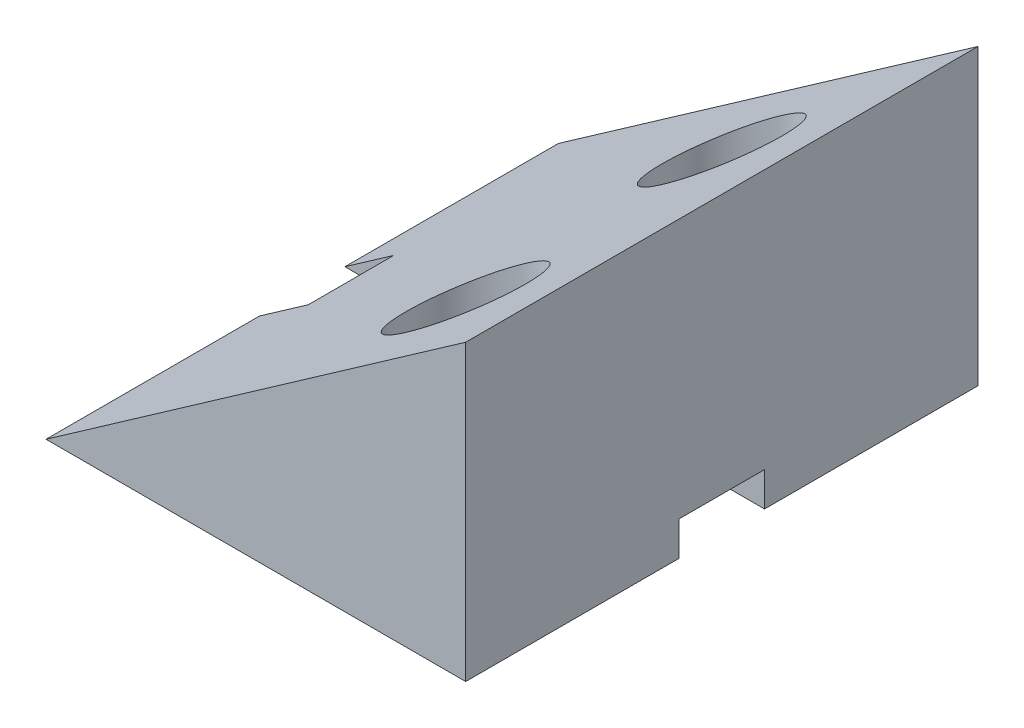
ISO-10303-21;
HEADER;
FILE_DESCRIPTION(('STEP AP214'),'2;1');
FILE_NAME('part.step','',(''),(''),'','','');
FILE_SCHEMA(('AUTOMOTIVE_DESIGN { 1 0 10303 214 1 1 1 1 }'));
ENDSEC;
DATA;
#1=APPLICATION_CONTEXT('core data for automotive mechanical design processes');
#2=APPLICATION_PROTOCOL_DEFINITION('international standard','automotive_design',2000,#1);
#3=PRODUCT_CONTEXT('',#1,'mechanical');
#4=PRODUCT('Part','Part','',(#3));
#5=PRODUCT_RELATED_PRODUCT_CATEGORY('part','',(#4));
#6=PRODUCT_DEFINITION_FORMATION('','',#4);
#7=PRODUCT_DEFINITION_CONTEXT('part definition',#1,'design');
#8=PRODUCT_DEFINITION('design','',#6,#7);
#9=PRODUCT_DEFINITION_SHAPE('','',#8);
#10=(LENGTH_UNIT() NAMED_UNIT(*) SI_UNIT(.MILLI.,.METRE.));
#11=(NAMED_UNIT(*) PLANE_ANGLE_UNIT() SI_UNIT($,.RADIAN.));
#12=(NAMED_UNIT(*) SI_UNIT($,.STERADIAN.) SOLID_ANGLE_UNIT());
#13=UNCERTAINTY_MEASURE_WITH_UNIT(LENGTH_MEASURE(1.E-05),#10,'distance_accuracy_value','');
#14=(GEOMETRIC_REPRESENTATION_CONTEXT(3) GLOBAL_UNCERTAINTY_ASSIGNED_CONTEXT((#13)) GLOBAL_UNIT_ASSIGNED_CONTEXT((#10,
#11,#12)) REPRESENTATION_CONTEXT('',''));
#15=CARTESIAN_POINT('',(0.,0.,0.));
#16=DIRECTION('',(0.,0.,1.));
#17=DIRECTION('',(1.,0.,0.));
#18=AXIS2_PLACEMENT_3D('',#15,#16,#17);
#19=CARTESIAN_POINT('',(0.,0.,30.));
#20=DIRECTION('',(0.,1.,0.));
#21=DIRECTION('',(-1.,0.,0.));
#22=AXIS2_PLACEMENT_3D('',#19,#20,#21);
#23=PLANE('',#22);
#24=CARTESIAN_POINT('',(-7.5,0.,22.5));
#25=DIRECTION('',(0.,1.,0.));
#26=DIRECTION('',(-1.,0.,0.));
#27=AXIS2_PLACEMENT_3D('',#24,#25,#26);
#28=CIRCLE('',#27,1.75);
#29=CARTESIAN_POINT('',(-9.25,0.,22.5));
#30=VERTEX_POINT('',#29);
#31=EDGE_CURVE('E143',#30,#30,#28,.F.);
#32=ORIENTED_EDGE('',*,*,#31,.F.);
#33=EDGE_LOOP('',(#32));
#34=FACE_BOUND('',#33,.T.);
#35=DIRECTION('',(0.,0.,-1.));
#36=VECTOR('',#35,1.);
#37=CARTESIAN_POINT('',(-24.5745613286699,0.,30.));
#38=LINE('',#37,#36);
#39=CARTESIAN_POINT('',(-24.5745613286699,0.,30.));
#40=VERTEX_POINT('',#39);
#41=CARTESIAN_POINT('',(-24.5745613286699,0.,17.5));
#42=VERTEX_POINT('',#41);
#43=EDGE_CURVE('E42',#40,#42,#38,.T.);
#44=ORIENTED_EDGE('',*,*,#43,.T.);
#45=DIRECTION('',(1.,0.,0.));
#46=VECTOR('',#45,1.);
#47=CARTESIAN_POINT('',(-24.5755613286699,0.,17.5));
#48=LINE('',#47,#46);
#49=CARTESIAN_POINT('',(0.,0.,17.5));
#50=VERTEX_POINT('',#49);
#51=EDGE_CURVE('E103',#42,#50,#48,.T.);
#52=ORIENTED_EDGE('',*,*,#51,.T.);
#53=DIRECTION('',(0.,0.,-1.));
#54=VECTOR('',#53,1.);
#55=CARTESIAN_POINT('',(0.,0.,30.));
#56=LINE('',#55,#54);
#57=CARTESIAN_POINT('',(0.,0.,30.));
#58=VERTEX_POINT('',#57);
#59=EDGE_CURVE('E121',#58,#50,#56,.T.);
#60=ORIENTED_EDGE('',*,*,#59,.F.);
#61=DIRECTION('',(1.,0.,0.));
#62=VECTOR('',#61,1.);
#63=CARTESIAN_POINT('',(0.,0.,30.));
#64=LINE('',#63,#62);
#65=EDGE_CURVE('E58',#40,#58,#64,.T.);
#66=ORIENTED_EDGE('',*,*,#65,.F.);
#67=EDGE_LOOP('',(#44,#52,#60,#66));
#68=FACE_BOUND('',#67,.T.);
#69=ADVANCED_FACE('F34',(#34,#68),#23,.F.);
#70=CARTESIAN_POINT('',(0.,17.2072930905312,30.));
#71=DIRECTION('',(-1.,0.,0.));
#72=DIRECTION('',(0.,-1.,0.));
#73=AXIS2_PLACEMENT_3D('',#70,#71,#72);
#74=PLANE('',#73);
#75=ORIENTED_EDGE('',*,*,#59,.T.);
#76=DIRECTION('',(0.,-1.,0.));
#77=VECTOR('',#76,1.);
#78=CARTESIAN_POINT('',(0.,2.,17.5));
#79=LINE('',#78,#77);
#80=CARTESIAN_POINT('',(0.,2.,17.5));
#81=VERTEX_POINT('',#80);
#82=EDGE_CURVE('E109',#81,#50,#79,.T.);
#83=ORIENTED_EDGE('',*,*,#82,.F.);
#84=DIRECTION('',(0.,0.,1.));
#85=VECTOR('',#84,1.);
#86=CARTESIAN_POINT('',(0.,2.,17.5));
#87=LINE('',#86,#85);
#88=CARTESIAN_POINT('',(0.,2.,12.5));
#89=VERTEX_POINT('',#88);
#90=EDGE_CURVE('E114',#89,#81,#87,.T.);
#91=ORIENTED_EDGE('',*,*,#90,.F.);
#92=DIRECTION('',(0.,1.,0.));
#93=VECTOR('',#92,1.);
#94=CARTESIAN_POINT('',(0.,2.,12.5));
#95=LINE('',#94,#93);
#96=CARTESIAN_POINT('',(0.,0.,12.5));
#97=VERTEX_POINT('',#96);
#98=EDGE_CURVE('E166',#97,#89,#95,.T.);
#99=ORIENTED_EDGE('',*,*,#98,.F.);
#100=CARTESIAN_POINT('',(0.,0.,0.));
#101=VERTEX_POINT('',#100);
#102=EDGE_CURVE('E76',#97,#101,#56,.T.);
#103=ORIENTED_EDGE('',*,*,#102,.T.);
#104=DIRECTION('',(0.,1.,0.));
#105=VECTOR('',#104,1.);
#106=CARTESIAN_POINT('',(0.,17.2072930905312,0.));
#107=LINE('',#106,#105);
#108=CARTESIAN_POINT('',(0.,17.2072930905312,0.));
#109=VERTEX_POINT('',#108);
#110=EDGE_CURVE('E130',#101,#109,#107,.T.);
#111=ORIENTED_EDGE('',*,*,#110,.T.);
#112=DIRECTION('',(0.,0.,-1.));
#113=VECTOR('',#112,1.);
#114=CARTESIAN_POINT('',(0.,17.2072930905312,30.));
#115=LINE('',#114,#113);
#116=CARTESIAN_POINT('',(0.,17.2072930905312,30.));
#117=VERTEX_POINT('',#116);
#118=EDGE_CURVE('E11',#117,#109,#115,.T.);
#119=ORIENTED_EDGE('',*,*,#118,.F.);
#120=DIRECTION('',(0.,1.,0.));
#121=VECTOR('',#120,1.);
#122=CARTESIAN_POINT('',(0.,17.2072930905312,30.));
#123=LINE('',#122,#121);
#124=EDGE_CURVE('E126',#58,#117,#123,.T.);
#125=ORIENTED_EDGE('',*,*,#124,.F.);
#126=EDGE_LOOP('',(#75,#83,#91,#99,#103,#111,#119,#125));
#127=FACE_BOUND('',#126,.T.);
#128=ADVANCED_FACE('F36',(#127),#74,.F.);
#129=CARTESIAN_POINT('',(-24.5745613286699,0.,30.));
#130=DIRECTION('',(0.573576436351041,-0.819152044288995,0.));
#131=DIRECTION('',(0.819152044288995,0.573576436351041,0.));
#132=AXIS2_PLACEMENT_3D('',#129,#130,#131);
#133=PLANE('',#132);
#134=CARTESIAN_POINT('',(-7.5,11.9557365539585,7.5));
#135=DIRECTION('',(0.573576436351041,-0.819152044288995,0.));
#136=DIRECTION('',(-0.819152044288995,-0.573576436351041,0.));
#137=AXIS2_PLACEMENT_3D('',#134,#135,#136);
#138=ELLIPSE('',#137,4.27271106066508,3.5);
#139=CARTESIAN_POINT('',(-11.,9.50501017022453,7.5));
#140=VERTEX_POINT('',#139);
#141=EDGE_CURVE('E132',#140,#140,#138,.F.);
#142=ORIENTED_EDGE('',*,*,#141,.F.);
#143=EDGE_LOOP('',(#142));
#144=FACE_BOUND('',#143,.T.);
#145=CARTESIAN_POINT('',(-7.5,11.9557365539585,22.5));
#146=DIRECTION('',(0.573576436351041,-0.819152044288995,0.));
#147=DIRECTION('',(-0.819152044288995,-0.573576436351041,0.));
#148=AXIS2_PLACEMENT_3D('',#145,#146,#147);
#149=ELLIPSE('',#148,4.27271106066508,3.5);
#150=CARTESIAN_POINT('',(-11.,9.50501017022453,22.5));
#151=VERTEX_POINT('',#150);
#152=EDGE_CURVE('E136',#151,#151,#149,.F.);
#153=ORIENTED_EDGE('',*,*,#152,.F.);
#154=EDGE_LOOP('',(#153));
#155=FACE_BOUND('',#154,.T.);
#156=DIRECTION('',(0.,0.,-1.));
#157=VECTOR('',#156,1.);
#158=CARTESIAN_POINT('',(-21.7182653151856,2.,17.5));
#159=LINE('',#158,#157);
#160=CARTESIAN_POINT('',(-21.7182653151856,2.,17.5));
#161=VERTEX_POINT('',#160);
#162=CARTESIAN_POINT('',(-21.7182653151856,2.,12.5));
#163=VERTEX_POINT('',#162);
#164=EDGE_CURVE('E118',#161,#163,#159,.T.);
#165=ORIENTED_EDGE('',*,*,#164,.F.);
#166=DIRECTION('',(0.819152044288995,0.573576436351041,0.));
#167=VECTOR('',#166,1.);
#168=CARTESIAN_POINT('',(-23.6355397179556,0.657510010363929,17.5));
#169=LINE('',#168,#167);
#170=EDGE_CURVE('E106',#42,#161,#169,.T.);
#171=ORIENTED_EDGE('',*,*,#170,.F.);
#172=ORIENTED_EDGE('',*,*,#43,.F.);
#173=DIRECTION('',(-0.819152044288995,-0.573576436351041,0.));
#174=VECTOR('',#173,1.);
#175=CARTESIAN_POINT('',(-24.5745613286699,0.,30.));
#176=LINE('',#175,#174);
#177=EDGE_CURVE('E81',#117,#40,#176,.T.);
#178=ORIENTED_EDGE('',*,*,#177,.F.);
#179=ORIENTED_EDGE('',*,*,#118,.T.);
#180=DIRECTION('',(-0.819152044288995,-0.573576436351041,0.));
#181=VECTOR('',#180,1.);
#182=CARTESIAN_POINT('',(-24.5745613286699,0.,0.));
#183=LINE('',#182,#181);
#184=CARTESIAN_POINT('',(-24.5745613286699,0.,0.));
#185=VERTEX_POINT('',#184);
#186=EDGE_CURVE('E127',#109,#185,#183,.T.);
#187=ORIENTED_EDGE('',*,*,#186,.T.);
#188=CARTESIAN_POINT('',(-24.5745613286699,0.,12.5));
#189=VERTEX_POINT('',#188);
#190=EDGE_CURVE('E120',#189,#185,#38,.T.);
#191=ORIENTED_EDGE('',*,*,#190,.F.);
#192=DIRECTION('',(-0.819152044288995,-0.573576436351041,0.));
#193=VECTOR('',#192,1.);
#194=CARTESIAN_POINT('',(-23.6355397179556,0.657510010363929,12.5));
#195=LINE('',#194,#193);
#196=EDGE_CURVE('E49',#163,#189,#195,.T.);
#197=ORIENTED_EDGE('',*,*,#196,.F.);
#198=EDGE_LOOP('',(#165,#171,#172,#178,#179,#187,#191,#197));
#199=FACE_BOUND('',#198,.T.);
#200=ADVANCED_FACE('F116',(#144,#155,#199),#133,.F.);
#201=CARTESIAN_POINT('',(-7.5,0.,7.5));
#202=DIRECTION('',(0.,1.,0.));
#203=DIRECTION('',(-1.,0.,0.));
#204=AXIS2_PLACEMENT_3D('',#201,#202,#203);
#205=CIRCLE('',#204,1.75);
#206=CARTESIAN_POINT('',(-9.25,0.,7.5));
#207=VERTEX_POINT('',#206);
#208=EDGE_CURVE('E152',#207,#207,#205,.F.);
#209=ORIENTED_EDGE('',*,*,#208,.F.);
#210=EDGE_LOOP('',(#209));
#211=FACE_BOUND('',#210,.T.);
#212=ORIENTED_EDGE('',*,*,#102,.F.);
#213=DIRECTION('',(1.,0.,0.));
#214=VECTOR('',#213,1.);
#215=CARTESIAN_POINT('',(-24.5755613286699,0.,12.5));
#216=LINE('',#215,#214);
#217=EDGE_CURVE('E113',#189,#97,#216,.T.);
#218=ORIENTED_EDGE('',*,*,#217,.F.);
#219=ORIENTED_EDGE('',*,*,#190,.T.);
#220=DIRECTION('',(1.,0.,0.));
#221=VECTOR('',#220,1.);
#222=CARTESIAN_POINT('',(0.,0.,0.));
#223=LINE('',#222,#221);
#224=EDGE_CURVE('E124',#185,#101,#223,.T.);
#225=ORIENTED_EDGE('',*,*,#224,.T.);
#226=EDGE_LOOP('',(#212,#218,#219,#225));
#227=FACE_BOUND('',#226,.T.);
#228=ADVANCED_FACE('F176',(#211,#227),#23,.F.);
#229=CARTESIAN_POINT('',(0.,0.,30.));
#230=DIRECTION('',(0.,0.,-1.));
#231=DIRECTION('',(-1.,0.,0.));
#232=AXIS2_PLACEMENT_3D('',#229,#230,#231);
#233=PLANE('',#232);
#234=ORIENTED_EDGE('',*,*,#124,.T.);
#235=ORIENTED_EDGE('',*,*,#177,.T.);
#236=ORIENTED_EDGE('',*,*,#65,.T.);
#237=EDGE_LOOP('',(#234,#235,#236));
#238=FACE_BOUND('',#237,.T.);
#239=ADVANCED_FACE('F182',(#238),#233,.F.);
#240=CARTESIAN_POINT('',(0.,0.,0.));
#241=DIRECTION('',(0.,0.,-1.));
#242=DIRECTION('',(-1.,0.,0.));
#243=AXIS2_PLACEMENT_3D('',#240,#241,#242);
#244=PLANE('',#243);
#245=ORIENTED_EDGE('',*,*,#110,.F.);
#246=ORIENTED_EDGE('',*,*,#224,.F.);
#247=ORIENTED_EDGE('',*,*,#186,.F.);
#248=EDGE_LOOP('',(#245,#246,#247));
#249=FACE_BOUND('',#248,.T.);
#250=ADVANCED_FACE('F184',(#249),#244,.T.);
#251=CARTESIAN_POINT('',(-7.5,17.2082930905312,22.5));
#252=DIRECTION('',(0.,-1.,0.));
#253=DIRECTION('',(1.,0.,0.));
#254=AXIS2_PLACEMENT_3D('',#251,#252,#253);
#255=CYLINDRICAL_SURFACE('',#254,3.5);
#256=CARTESIAN_POINT('',(-7.5,6.,22.5));
#257=DIRECTION('',(0.,-1.,0.));
#258=DIRECTION('',(1.,0.,0.));
#259=AXIS2_PLACEMENT_3D('',#256,#257,#258);
#260=CIRCLE('',#259,3.5);
#261=CARTESIAN_POINT('',(-4.,6.,22.5));
#262=VERTEX_POINT('',#261);
#263=EDGE_CURVE('E140',#262,#262,#260,.T.);
#264=ORIENTED_EDGE('',*,*,#263,.T.);
#265=EDGE_LOOP('',(#264));
#266=FACE_BOUND('',#265,.T.);
#267=ORIENTED_EDGE('',*,*,#152,.T.);
#268=EDGE_LOOP('',(#267));
#269=FACE_BOUND('',#268,.T.);
#270=ADVANCED_FACE('F190',(#266,#269),#255,.F.);
#271=CARTESIAN_POINT('',(-7.5,6.,22.5));
#272=DIRECTION('',(0.,-1.,0.));
#273=DIRECTION('',(1.,0.,0.));
#274=AXIS2_PLACEMENT_3D('',#271,#272,#273);
#275=PLANE('',#274);
#276=CARTESIAN_POINT('',(-7.5,6.,22.5));
#277=DIRECTION('',(0.,1.,0.));
#278=DIRECTION('',(-1.,0.,0.));
#279=AXIS2_PLACEMENT_3D('',#276,#277,#278);
#280=CIRCLE('',#279,1.75);
#281=CARTESIAN_POINT('',(-9.25,6.,22.5));
#282=VERTEX_POINT('',#281);
#283=EDGE_CURVE('E151',#282,#282,#280,.T.);
#284=ORIENTED_EDGE('',*,*,#283,.F.);
#285=EDGE_LOOP('',(#284));
#286=FACE_BOUND('',#285,.T.);
#287=ORIENTED_EDGE('',*,*,#263,.F.);
#288=EDGE_LOOP('',(#287));
#289=FACE_BOUND('',#288,.T.);
#290=ADVANCED_FACE('F211',(#286,#289),#275,.F.);
#291=CARTESIAN_POINT('',(-7.5,17.2082930905312,7.5));
#292=DIRECTION('',(0.,-1.,0.));
#293=DIRECTION('',(1.,0.,0.));
#294=AXIS2_PLACEMENT_3D('',#291,#292,#293);
#295=CYLINDRICAL_SURFACE('',#294,3.5);
#296=CARTESIAN_POINT('',(-7.5,6.,7.5));
#297=DIRECTION('',(0.,-1.,0.));
#298=DIRECTION('',(1.,0.,0.));
#299=AXIS2_PLACEMENT_3D('',#296,#297,#298);
#300=CIRCLE('',#299,3.5);
#301=CARTESIAN_POINT('',(-4.,6.,7.5));
#302=VERTEX_POINT('',#301);
#303=EDGE_CURVE('E139',#302,#302,#300,.T.);
#304=ORIENTED_EDGE('',*,*,#303,.T.);
#305=EDGE_LOOP('',(#304));
#306=FACE_BOUND('',#305,.T.);
#307=ORIENTED_EDGE('',*,*,#141,.T.);
#308=EDGE_LOOP('',(#307));
#309=FACE_BOUND('',#308,.T.);
#310=ADVANCED_FACE('F216',(#306,#309),#295,.F.);
#311=CARTESIAN_POINT('',(-7.5,6.,7.5));
#312=DIRECTION('',(0.,-1.,0.));
#313=DIRECTION('',(1.,0.,0.));
#314=AXIS2_PLACEMENT_3D('',#311,#312,#313);
#315=PLANE('',#314);
#316=CARTESIAN_POINT('',(-7.5,6.,7.5));
#317=DIRECTION('',(0.,1.,0.));
#318=DIRECTION('',(-1.,0.,0.));
#319=AXIS2_PLACEMENT_3D('',#316,#317,#318);
#320=CIRCLE('',#319,1.75);
#321=CARTESIAN_POINT('',(-9.25,6.,7.5));
#322=VERTEX_POINT('',#321);
#323=EDGE_CURVE('E148',#322,#322,#320,.T.);
#324=ORIENTED_EDGE('',*,*,#323,.F.);
#325=EDGE_LOOP('',(#324));
#326=FACE_BOUND('',#325,.T.);
#327=ORIENTED_EDGE('',*,*,#303,.F.);
#328=EDGE_LOOP('',(#327));
#329=FACE_BOUND('',#328,.T.);
#330=ADVANCED_FACE('F222',(#326,#329),#315,.F.);
#331=CARTESIAN_POINT('',(-7.5,-0.00100000000000187,7.5));
#332=DIRECTION('',(0.,1.,0.));
#333=DIRECTION('',(-1.,0.,0.));
#334=AXIS2_PLACEMENT_3D('',#331,#332,#333);
#335=CYLINDRICAL_SURFACE('',#334,1.75);
#336=ORIENTED_EDGE('',*,*,#323,.T.);
#337=EDGE_LOOP('',(#336));
#338=FACE_BOUND('',#337,.T.);
#339=ORIENTED_EDGE('',*,*,#208,.T.);
#340=EDGE_LOOP('',(#339));
#341=FACE_BOUND('',#340,.T.);
#342=ADVANCED_FACE('F226',(#338,#341),#335,.F.);
#343=CARTESIAN_POINT('',(-7.5,-0.00100000000000187,22.5));
#344=DIRECTION('',(0.,1.,0.));
#345=DIRECTION('',(-1.,0.,0.));
#346=AXIS2_PLACEMENT_3D('',#343,#344,#345);
#347=CYLINDRICAL_SURFACE('',#346,1.75);
#348=ORIENTED_EDGE('',*,*,#283,.T.);
#349=EDGE_LOOP('',(#348));
#350=FACE_BOUND('',#349,.T.);
#351=ORIENTED_EDGE('',*,*,#31,.T.);
#352=EDGE_LOOP('',(#351));
#353=FACE_BOUND('',#352,.T.);
#354=ADVANCED_FACE('F230',(#350,#353),#347,.F.);
#355=CARTESIAN_POINT('',(-24.5755613286699,2.,17.5));
#356=DIRECTION('',(0.,0.,1.));
#357=DIRECTION('',(0.,-1.,0.));
#358=AXIS2_PLACEMENT_3D('',#355,#356,#357);
#359=PLANE('',#358);
#360=ORIENTED_EDGE('',*,*,#170,.T.);
#361=DIRECTION('',(1.,0.,0.));
#362=VECTOR('',#361,1.);
#363=CARTESIAN_POINT('',(-24.5755613286699,2.,17.5));
#364=LINE('',#363,#362);
#365=EDGE_CURVE('E155',#161,#81,#364,.T.);
#366=ORIENTED_EDGE('',*,*,#365,.T.);
#367=ORIENTED_EDGE('',*,*,#82,.T.);
#368=ORIENTED_EDGE('',*,*,#51,.F.);
#369=EDGE_LOOP('',(#360,#366,#367,#368));
#370=FACE_BOUND('',#369,.T.);
#371=ADVANCED_FACE('F105',(#370),#359,.F.);
#372=CARTESIAN_POINT('',(-24.5755613286699,2.,17.5));
#373=DIRECTION('',(0.,1.,0.));
#374=DIRECTION('',(-1.,0.,0.));
#375=AXIS2_PLACEMENT_3D('',#372,#373,#374);
#376=PLANE('',#375);
#377=ORIENTED_EDGE('',*,*,#164,.T.);
#378=DIRECTION('',(1.,0.,0.));
#379=VECTOR('',#378,1.);
#380=CARTESIAN_POINT('',(-24.5755613286699,2.,12.5));
#381=LINE('',#380,#379);
#382=EDGE_CURVE('E161',#163,#89,#381,.T.);
#383=ORIENTED_EDGE('',*,*,#382,.T.);
#384=ORIENTED_EDGE('',*,*,#90,.T.);
#385=ORIENTED_EDGE('',*,*,#365,.F.);
#386=EDGE_LOOP('',(#377,#383,#384,#385));
#387=FACE_BOUND('',#386,.T.);
#388=ADVANCED_FACE('F172',(#387),#376,.F.);
#389=CARTESIAN_POINT('',(-24.5755613286699,2.,12.5));
#390=DIRECTION('',(0.,0.,-1.));
#391=DIRECTION('',(0.,1.,0.));
#392=AXIS2_PLACEMENT_3D('',#389,#390,#391);
#393=PLANE('',#392);
#394=ORIENTED_EDGE('',*,*,#196,.T.);
#395=ORIENTED_EDGE('',*,*,#217,.T.);
#396=ORIENTED_EDGE('',*,*,#98,.T.);
#397=ORIENTED_EDGE('',*,*,#382,.F.);
#398=EDGE_LOOP('',(#394,#395,#396,#397));
#399=FACE_BOUND('',#398,.T.);
#400=ADVANCED_FACE('F178',(#399),#393,.F.);
#401=CLOSED_SHELL('',(#69,#128,#200,#228,#239,#250,#270,#290,#310,#330,#342,#354,#371,#388,#400));
#402=MANIFOLD_SOLID_BREP('B2',#401);
#403=ADVANCED_BREP_SHAPE_REPRESENTATION('',(#18,#402),#14);
#404=SHAPE_DEFINITION_REPRESENTATION(#9,#403);
ENDSEC;
END-ISO-10303-21;
